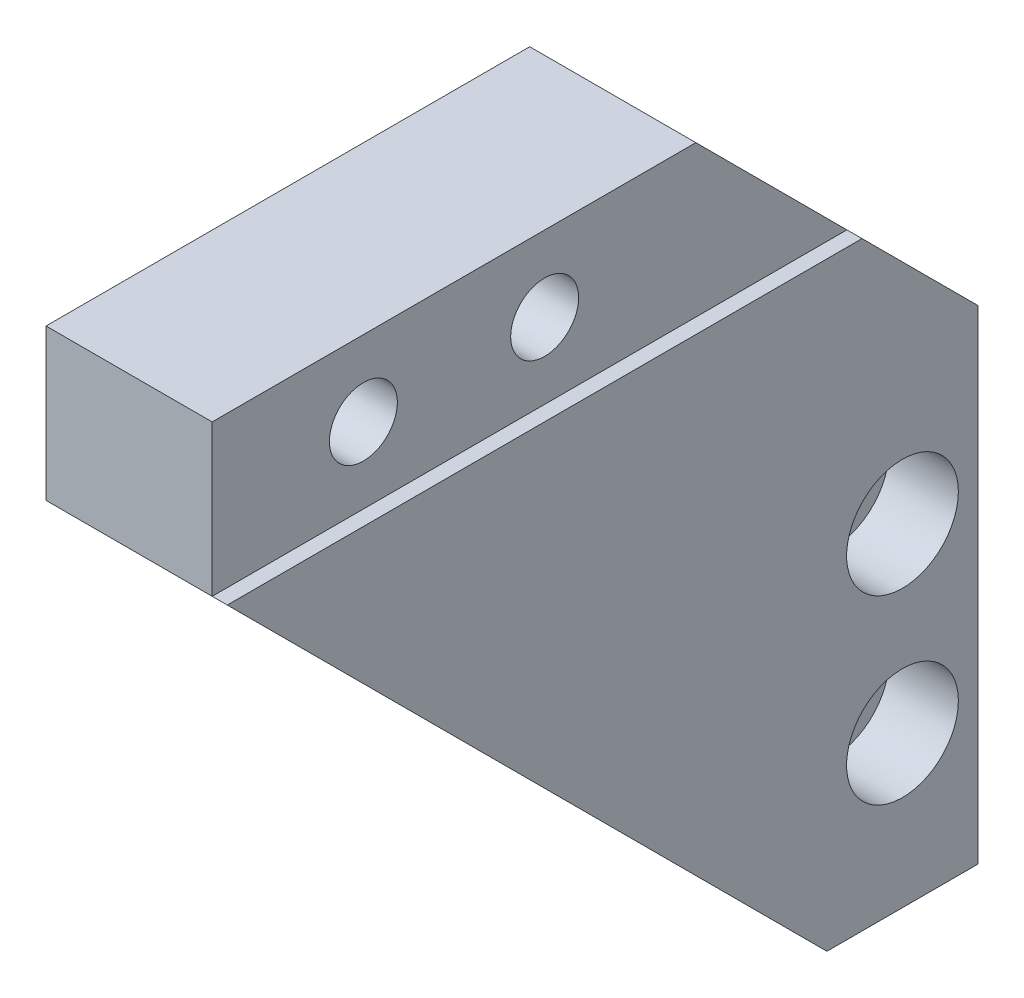
ISO-10303-21;
HEADER;
FILE_DESCRIPTION(('STEP AP214'),'2;1');
FILE_NAME('part.step','',(''),(''),'','','');
FILE_SCHEMA(('AUTOMOTIVE_DESIGN { 1 0 10303 214 1 1 1 1 }'));
ENDSEC;
DATA;
#1=APPLICATION_CONTEXT('core data for automotive mechanical design processes');
#2=APPLICATION_PROTOCOL_DEFINITION('international standard','automotive_design',2000,#1);
#3=PRODUCT_CONTEXT('',#1,'mechanical');
#4=PRODUCT('Part','Part','',(#3));
#5=PRODUCT_RELATED_PRODUCT_CATEGORY('part','',(#4));
#6=PRODUCT_DEFINITION_FORMATION('','',#4);
#7=PRODUCT_DEFINITION_CONTEXT('part definition',#1,'design');
#8=PRODUCT_DEFINITION('design','',#6,#7);
#9=PRODUCT_DEFINITION_SHAPE('','',#8);
#10=(LENGTH_UNIT() NAMED_UNIT(*) SI_UNIT(.MILLI.,.METRE.));
#11=(NAMED_UNIT(*) PLANE_ANGLE_UNIT() SI_UNIT($,.RADIAN.));
#12=(NAMED_UNIT(*) SI_UNIT($,.STERADIAN.) SOLID_ANGLE_UNIT());
#13=UNCERTAINTY_MEASURE_WITH_UNIT(LENGTH_MEASURE(1.E-05),#10,'distance_accuracy_value','');
#14=(GEOMETRIC_REPRESENTATION_CONTEXT(3) GLOBAL_UNCERTAINTY_ASSIGNED_CONTEXT((#13)) GLOBAL_UNIT_ASSIGNED_CONTEXT((#10,
#11,#12)) REPRESENTATION_CONTEXT('',''));
#15=CARTESIAN_POINT('',(0.,0.,0.));
#16=DIRECTION('',(0.,0.,1.));
#17=DIRECTION('',(1.,0.,0.));
#18=AXIS2_PLACEMENT_3D('',#15,#16,#17);
#19=CARTESIAN_POINT('',(6.,-17.6776695296637,-59.7));
#20=DIRECTION('',(0.,0.,1.));
#21=DIRECTION('',(1.,0.,0.));
#22=AXIS2_PLACEMENT_3D('',#19,#20,#21);
#23=PLANE('',#22);
#24=DIRECTION('',(0.,1.,0.));
#25=VECTOR('',#24,1.);
#26=CARTESIAN_POINT('',(6.,-17.6776695296637,-59.7));
#27=LINE('',#26,#25);
#28=CARTESIAN_POINT('',(6.,-49.7,-59.7));
#29=VERTEX_POINT('',#28);
#30=CARTESIAN_POINT('',(6.,-17.6776695296637,-59.7));
#31=VERTEX_POINT('',#30);
#32=EDGE_CURVE('E124',#29,#31,#27,.T.);
#33=ORIENTED_EDGE('',*,*,#32,.F.);
#34=DIRECTION('',(1.,0.,0.));
#35=VECTOR('',#34,1.);
#36=CARTESIAN_POINT('',(-6.,-49.7,-59.7));
#37=LINE('',#36,#35);
#38=CARTESIAN_POINT('',(-5.,-49.7,-59.7));
#39=VERTEX_POINT('',#38);
#40=EDGE_CURVE('E108',#39,#29,#37,.T.);
#41=ORIENTED_EDGE('',*,*,#40,.F.);
#42=DIRECTION('',(0.,-1.,0.));
#43=VECTOR('',#42,1.);
#44=CARTESIAN_POINT('',(-5.,-17.6776695296637,-59.7));
#45=LINE('',#44,#43);
#46=CARTESIAN_POINT('',(-5.,-17.6776695296637,-59.7));
#47=VERTEX_POINT('',#46);
#48=EDGE_CURVE('E254',#47,#39,#45,.T.);
#49=ORIENTED_EDGE('',*,*,#48,.F.);
#50=DIRECTION('',(-1.,0.,0.));
#51=VECTOR('',#50,1.);
#52=CARTESIAN_POINT('',(6.,-17.6776695296637,-59.7));
#53=LINE('',#52,#51);
#54=EDGE_CURVE('E130',#31,#47,#53,.T.);
#55=ORIENTED_EDGE('',*,*,#54,.F.);
#56=EDGE_LOOP('',(#33,#41,#49,#55));
#57=FACE_BOUND('',#56,.T.);
#58=ADVANCED_FACE('F36',(#57),#23,.F.);
#59=CARTESIAN_POINT('',(6.,-59.7,-59.7));
#60=DIRECTION('',(0.,0.707106781186547,-0.707106781186548));
#61=DIRECTION('',(0.,0.707106781186548,0.707106781186547));
#62=AXIS2_PLACEMENT_3D('',#59,#60,#61);
#63=PLANE('',#62);
#64=CARTESIAN_POINT('',(0.,-34.4461940777126,-34.4461940777126));
#65=DIRECTION('',(0.,-0.707106781186548,0.707106781186547));
#66=DIRECTION('',(0.,-0.707106781186547,-0.707106781186548));
#67=AXIS2_PLACEMENT_3D('',#64,#65,#66);
#68=CIRCLE('',#67,4.);
#69=CARTESIAN_POINT('',(0.,-37.2746212024587,-37.2746212024588));
#70=VERTEX_POINT('',#69);
#71=EDGE_CURVE('E155',#70,#70,#68,.T.);
#72=ORIENTED_EDGE('',*,*,#71,.F.);
#73=EDGE_LOOP('',(#72));
#74=FACE_BOUND('',#73,.T.);
#75=CARTESIAN_POINT('',(0.,-25.2538059222874,-25.2538059222875));
#76=DIRECTION('',(0.,-0.707106781186548,0.707106781186547));
#77=DIRECTION('',(0.,-0.707106781186547,-0.707106781186548));
#78=AXIS2_PLACEMENT_3D('',#75,#76,#77);
#79=CIRCLE('',#78,4.);
#80=CARTESIAN_POINT('',(0.,-28.0822330470336,-28.0822330470336));
#81=VERTEX_POINT('',#80);
#82=EDGE_CURVE('E210',#81,#81,#79,.T.);
#83=ORIENTED_EDGE('',*,*,#82,.F.);
#84=EDGE_LOOP('',(#83));
#85=FACE_BOUND('',#84,.T.);
#86=DIRECTION('',(-1.,0.,0.));
#87=VECTOR('',#86,1.);
#88=CARTESIAN_POINT('',(-5.,-49.7,-49.7));
#89=LINE('',#88,#87);
#90=CARTESIAN_POINT('',(-5.,-49.7,-49.7));
#91=VERTEX_POINT('',#90);
#92=CARTESIAN_POINT('',(-6.,-49.7,-49.7));
#93=VERTEX_POINT('',#92);
#94=EDGE_CURVE('E245',#91,#93,#89,.T.);
#95=ORIENTED_EDGE('',*,*,#94,.F.);
#96=DIRECTION('',(1.,0.,0.));
#97=VECTOR('',#96,1.);
#98=CARTESIAN_POINT('',(-6.,-49.7,-49.7));
#99=LINE('',#98,#97);
#100=CARTESIAN_POINT('',(6.,-49.7,-49.7));
#101=VERTEX_POINT('',#100);
#102=EDGE_CURVE('E118',#91,#101,#99,.T.);
#103=ORIENTED_EDGE('',*,*,#102,.T.);
#104=DIRECTION('',(0.,-0.707106781186548,-0.707106781186547));
#105=VECTOR('',#104,1.);
#106=CARTESIAN_POINT('',(6.,-59.7,-59.7));
#107=LINE('',#106,#105);
#108=CARTESIAN_POINT('',(6.,-9.99999999999999,-9.99999999999999));
#109=VERTEX_POINT('',#108);
#110=EDGE_CURVE('E127',#109,#101,#107,.T.);
#111=ORIENTED_EDGE('',*,*,#110,.F.);
#112=DIRECTION('',(1.,0.,0.));
#113=VECTOR('',#112,1.);
#114=CARTESIAN_POINT('',(5.,-10.,-10.));
#115=LINE('',#114,#113);
#116=CARTESIAN_POINT('',(5.,-10.,-10.));
#117=VERTEX_POINT('',#116);
#118=EDGE_CURVE('E59',#117,#109,#115,.T.);
#119=ORIENTED_EDGE('',*,*,#118,.F.);
#120=DIRECTION('',(1.,0.,0.));
#121=VECTOR('',#120,1.);
#122=CARTESIAN_POINT('',(-6.,-9.99999999999998,-9.99999999999998));
#123=LINE('',#122,#121);
#124=CARTESIAN_POINT('',(-6.,-9.99999999999998,-9.99999999999998));
#125=VERTEX_POINT('',#124);
#126=EDGE_CURVE('E182',#125,#117,#123,.T.);
#127=ORIENTED_EDGE('',*,*,#126,.F.);
#128=DIRECTION('',(0.,-0.707106781186548,-0.707106781186547));
#129=VECTOR('',#128,1.);
#130=CARTESIAN_POINT('',(-6.,-59.7,-59.7));
#131=LINE('',#130,#129);
#132=EDGE_CURVE('E51',#125,#93,#131,.T.);
#133=ORIENTED_EDGE('',*,*,#132,.T.);
#134=EDGE_LOOP('',(#95,#103,#111,#119,#127,#133));
#135=FACE_BOUND('',#134,.T.);
#136=ADVANCED_FACE('F38',(#74,#85,#135),#63,.F.);
#137=CARTESIAN_POINT('',(6.,0.,-42.0223304703363));
#138=DIRECTION('',(0.,-0.707106781186547,0.707106781186548));
#139=DIRECTION('',(0.,-0.707106781186548,-0.707106781186547));
#140=AXIS2_PLACEMENT_3D('',#137,#138,#139);
#141=PLANE('',#140);
#142=CARTESIAN_POINT('',(0.,-13.4350288425444,-55.4573593128807));
#143=DIRECTION('',(0.,-0.707106781186547,0.707106781186548));
#144=DIRECTION('',(0.,-0.707106781186548,-0.707106781186547));
#145=AXIS2_PLACEMENT_3D('',#142,#143,#144);
#146=CIRCLE('',#145,2.25);
#147=CARTESIAN_POINT('',(0.,-15.0260191002141,-57.0483495705504));
#148=VERTEX_POINT('',#147);
#149=EDGE_CURVE('E142',#148,#148,#146,.T.);
#150=ORIENTED_EDGE('',*,*,#149,.T.);
#151=EDGE_LOOP('',(#150));
#152=FACE_BOUND('',#151,.T.);
#153=CARTESIAN_POINT('',(0.,-4.24264068711929,-46.2649711574556));
#154=DIRECTION('',(0.,-0.707106781186547,0.707106781186548));
#155=DIRECTION('',(0.,-0.707106781186548,-0.707106781186547));
#156=AXIS2_PLACEMENT_3D('',#153,#154,#155);
#157=CIRCLE('',#156,2.25);
#158=CARTESIAN_POINT('',(0.,-5.83363094478902,-47.8559614151253));
#159=VERTEX_POINT('',#158);
#160=EDGE_CURVE('E152',#159,#159,#157,.T.);
#161=ORIENTED_EDGE('',*,*,#160,.T.);
#162=EDGE_LOOP('',(#161));
#163=FACE_BOUND('',#162,.T.);
#164=DIRECTION('',(0.,-0.707106781186548,-0.707106781186548));
#165=VECTOR('',#164,1.);
#166=CARTESIAN_POINT('',(-5.,-7.67766952966369,-49.7));
#167=LINE('',#166,#165);
#168=CARTESIAN_POINT('',(-5.,-7.67766952966369,-49.7));
#169=VERTEX_POINT('',#168);
#170=EDGE_CURVE('E297',#169,#47,#167,.T.);
#171=ORIENTED_EDGE('',*,*,#170,.F.);
#172=DIRECTION('',(-1.,0.,0.));
#173=VECTOR('',#172,1.);
#174=CARTESIAN_POINT('',(-5.,-7.67766952966369,-49.7));
#175=LINE('',#174,#173);
#176=CARTESIAN_POINT('',(-6.,-7.67766952966369,-49.7));
#177=VERTEX_POINT('',#176);
#178=EDGE_CURVE('E206',#169,#177,#175,.T.);
#179=ORIENTED_EDGE('',*,*,#178,.T.);
#180=DIRECTION('',(0.,0.707106781186548,0.707106781186547));
#181=VECTOR('',#180,1.);
#182=CARTESIAN_POINT('',(-6.,0.,-42.0223304703363));
#183=LINE('',#182,#181);
#184=CARTESIAN_POINT('',(-6.,0.,-42.0223304703363));
#185=VERTEX_POINT('',#184);
#186=EDGE_CURVE('E141',#177,#185,#183,.T.);
#187=ORIENTED_EDGE('',*,*,#186,.T.);
#188=DIRECTION('',(-1.,0.,0.));
#189=VECTOR('',#188,1.);
#190=CARTESIAN_POINT('',(6.,0.,-42.0223304703363));
#191=LINE('',#190,#189);
#192=CARTESIAN_POINT('',(5.,0.,-42.0223304703363));
#193=VERTEX_POINT('',#192);
#194=EDGE_CURVE('E134',#193,#185,#191,.T.);
#195=ORIENTED_EDGE('',*,*,#194,.F.);
#196=DIRECTION('',(0.,-0.707106781186547,-0.707106781186548));
#197=VECTOR('',#196,1.);
#198=CARTESIAN_POINT('',(5.,-10.,-52.0223304703363));
#199=LINE('',#198,#197);
#200=CARTESIAN_POINT('',(5.,-10.,-52.0223304703363));
#201=VERTEX_POINT('',#200);
#202=EDGE_CURVE('E196',#193,#201,#199,.T.);
#203=ORIENTED_EDGE('',*,*,#202,.T.);
#204=DIRECTION('',(1.,0.,0.));
#205=VECTOR('',#204,1.);
#206=CARTESIAN_POINT('',(5.,-10.,-52.0223304703363));
#207=LINE('',#206,#205);
#208=CARTESIAN_POINT('',(6.,-10.,-52.0223304703363));
#209=VERTEX_POINT('',#208);
#210=EDGE_CURVE('E200',#201,#209,#207,.T.);
#211=ORIENTED_EDGE('',*,*,#210,.T.);
#212=DIRECTION('',(0.,0.707106781186548,0.707106781186547));
#213=VECTOR('',#212,1.);
#214=CARTESIAN_POINT('',(6.,0.,-42.0223304703363));
#215=LINE('',#214,#213);
#216=EDGE_CURVE('E132',#31,#209,#215,.T.);
#217=ORIENTED_EDGE('',*,*,#216,.F.);
#218=ORIENTED_EDGE('',*,*,#54,.T.);
#219=EDGE_LOOP('',(#171,#179,#187,#195,#203,#211,#217,#218));
#220=FACE_BOUND('',#219,.T.);
#221=ADVANCED_FACE('F243',(#152,#163,#220),#141,.F.);
#222=CARTESIAN_POINT('',(6.,0.,0.));
#223=DIRECTION('',(0.,-1.,0.));
#224=DIRECTION('',(0.,0.,-1.));
#225=AXIS2_PLACEMENT_3D('',#222,#223,#224);
#226=PLANE('',#225);
#227=DIRECTION('',(0.,0.,1.));
#228=VECTOR('',#227,1.);
#229=CARTESIAN_POINT('',(-6.,0.,0.));
#230=LINE('',#229,#228);
#231=CARTESIAN_POINT('',(-6.,0.,-9.99999999999998));
#232=VERTEX_POINT('',#231);
#233=EDGE_CURVE('E136',#185,#232,#230,.T.);
#234=ORIENTED_EDGE('',*,*,#233,.T.);
#235=DIRECTION('',(1.,0.,0.));
#236=VECTOR('',#235,1.);
#237=CARTESIAN_POINT('',(-6.,0.,-9.99999999999998));
#238=LINE('',#237,#236);
#239=CARTESIAN_POINT('',(5.,0.,-9.99999999999998));
#240=VERTEX_POINT('',#239);
#241=EDGE_CURVE('E180',#232,#240,#238,.T.);
#242=ORIENTED_EDGE('',*,*,#241,.T.);
#243=DIRECTION('',(0.,0.,-1.));
#244=VECTOR('',#243,1.);
#245=CARTESIAN_POINT('',(5.,0.,-42.0223304703363));
#246=LINE('',#245,#244);
#247=EDGE_CURVE('E187',#240,#193,#246,.T.);
#248=ORIENTED_EDGE('',*,*,#247,.T.);
#249=ORIENTED_EDGE('',*,*,#194,.T.);
#250=EDGE_LOOP('',(#234,#242,#248,#249));
#251=FACE_BOUND('',#250,.T.);
#252=ADVANCED_FACE('F186',(#251),#226,.F.);
#253=CARTESIAN_POINT('',(6.,0.,0.));
#254=DIRECTION('',(-1.,0.,0.));
#255=DIRECTION('',(0.,0.,1.));
#256=AXIS2_PLACEMENT_3D('',#253,#254,#255);
#257=PLANE('',#256);
#258=CARTESIAN_POINT('',(6.,-39.6888347648318,-54.7));
#259=DIRECTION('',(1.,0.,0.));
#260=DIRECTION('',(0.,0.,-1.));
#261=AXIS2_PLACEMENT_3D('',#258,#259,#260);
#262=CIRCLE('',#261,3.69999999999999);
#263=CARTESIAN_POINT('',(6.,-39.6888347648318,-58.4));
#264=VERTEX_POINT('',#263);
#265=EDGE_CURVE('E191',#264,#264,#262,.T.);
#266=ORIENTED_EDGE('',*,*,#265,.F.);
#267=EDGE_LOOP('',(#266));
#268=FACE_BOUND('',#267,.T.);
#269=CARTESIAN_POINT('',(6.,-27.6888347648318,-54.7));
#270=DIRECTION('',(1.,0.,0.));
#271=DIRECTION('',(0.,0.,-1.));
#272=AXIS2_PLACEMENT_3D('',#269,#270,#271);
#273=CIRCLE('',#272,3.69999999999999);
#274=CARTESIAN_POINT('',(6.,-27.6888347648318,-58.4));
#275=VERTEX_POINT('',#274);
#276=EDGE_CURVE('E174',#275,#275,#273,.T.);
#277=ORIENTED_EDGE('',*,*,#276,.F.);
#278=EDGE_LOOP('',(#277));
#279=FACE_BOUND('',#278,.T.);
#280=ORIENTED_EDGE('',*,*,#110,.T.);
#281=DIRECTION('',(0.,0.,1.));
#282=VECTOR('',#281,1.);
#283=CARTESIAN_POINT('',(6.,-49.7,-59.7));
#284=LINE('',#283,#282);
#285=EDGE_CURVE('E111',#29,#101,#284,.T.);
#286=ORIENTED_EDGE('',*,*,#285,.F.);
#287=ORIENTED_EDGE('',*,*,#32,.T.);
#288=ORIENTED_EDGE('',*,*,#216,.T.);
#289=DIRECTION('',(0.,0.,1.));
#290=VECTOR('',#289,1.);
#291=CARTESIAN_POINT('',(6.,-10.,-10.));
#292=LINE('',#291,#290);
#293=EDGE_CURVE('E205',#209,#109,#292,.T.);
#294=ORIENTED_EDGE('',*,*,#293,.T.);
#295=EDGE_LOOP('',(#280,#286,#287,#288,#294));
#296=FACE_BOUND('',#295,.T.);
#297=ADVANCED_FACE('F122',(#268,#279,#296),#257,.F.);
#298=CARTESIAN_POINT('',(-6.,0.,0.));
#299=DIRECTION('',(-1.,0.,0.));
#300=DIRECTION('',(0.,0.,1.));
#301=AXIS2_PLACEMENT_3D('',#298,#299,#300);
#302=PLANE('',#301);
#303=DIRECTION('',(0.,1.,0.));
#304=VECTOR('',#303,1.);
#305=CARTESIAN_POINT('',(-6.,-9.99999999999998,-9.99999999999998));
#306=LINE('',#305,#304);
#307=EDGE_CURVE('E264',#125,#232,#306,.T.);
#308=ORIENTED_EDGE('',*,*,#307,.T.);
#309=ORIENTED_EDGE('',*,*,#233,.F.);
#310=ORIENTED_EDGE('',*,*,#186,.F.);
#311=DIRECTION('',(0.,1.,0.));
#312=VECTOR('',#311,1.);
#313=CARTESIAN_POINT('',(-6.,-49.7,-49.7));
#314=LINE('',#313,#312);
#315=EDGE_CURVE('E160',#93,#177,#314,.T.);
#316=ORIENTED_EDGE('',*,*,#315,.F.);
#317=ORIENTED_EDGE('',*,*,#132,.F.);
#318=EDGE_LOOP('',(#308,#309,#310,#316,#317));
#319=FACE_BOUND('',#318,.T.);
#320=CARTESIAN_POINT('',(-6.,-5.,-20.0111652351682));
#321=DIRECTION('',(-1.,0.,0.));
#322=DIRECTION('',(0.,0.,1.));
#323=AXIS2_PLACEMENT_3D('',#320,#321,#322);
#324=CIRCLE('',#323,3.7);
#325=CARTESIAN_POINT('',(-6.,-5.,-16.3111652351682));
#326=VERTEX_POINT('',#325);
#327=EDGE_CURVE('E170',#326,#326,#324,.T.);
#328=ORIENTED_EDGE('',*,*,#327,.F.);
#329=EDGE_LOOP('',(#328));
#330=FACE_BOUND('',#329,.T.);
#331=CARTESIAN_POINT('',(-6.,-5.,-32.0111652351682));
#332=DIRECTION('',(-1.,0.,0.));
#333=DIRECTION('',(0.,0.,1.));
#334=AXIS2_PLACEMENT_3D('',#331,#332,#333);
#335=CIRCLE('',#334,3.7);
#336=CARTESIAN_POINT('',(-6.,-5.,-28.3111652351682));
#337=VERTEX_POINT('',#336);
#338=EDGE_CURVE('E165',#337,#337,#335,.T.);
#339=ORIENTED_EDGE('',*,*,#338,.F.);
#340=EDGE_LOOP('',(#339));
#341=FACE_BOUND('',#340,.T.);
#342=ADVANCED_FACE('F262',(#319,#330,#341),#302,.T.);
#343=CARTESIAN_POINT('',(0.,-34.4461940777126,-34.4461940777126));
#344=DIRECTION('',(0.,-0.707106781186548,0.707106781186547));
#345=DIRECTION('',(0.,-0.707106781186547,-0.707106781186548));
#346=AXIS2_PLACEMENT_3D('',#343,#344,#345);
#347=CYLINDRICAL_SURFACE('',#346,2.25);
#348=CARTESIAN_POINT('',(0.,-31.1935028842544,-37.6988852711707));
#349=DIRECTION('',(0.,-0.707106781186548,0.707106781186547));
#350=DIRECTION('',(0.,-0.707106781186547,-0.707106781186548));
#351=AXIS2_PLACEMENT_3D('',#348,#349,#350);
#352=CIRCLE('',#351,2.25);
#353=CARTESIAN_POINT('',(0.,-32.7844931419242,-39.2898755288404));
#354=VERTEX_POINT('',#353);
#355=EDGE_CURVE('E151',#354,#354,#352,.T.);
#356=ORIENTED_EDGE('',*,*,#355,.T.);
#357=EDGE_LOOP('',(#356));
#358=FACE_BOUND('',#357,.T.);
#359=ORIENTED_EDGE('',*,*,#149,.F.);
#360=EDGE_LOOP('',(#359));
#361=FACE_BOUND('',#360,.T.);
#362=ADVANCED_FACE('F225',(#358,#361),#347,.F.);
#363=CARTESIAN_POINT('',(2.25,-31.1935028842544,-37.6988852711707));
#364=DIRECTION('',(0.,0.707106781186548,-0.707106781186547));
#365=DIRECTION('',(0.,0.707106781186547,0.707106781186548));
#366=AXIS2_PLACEMENT_3D('',#363,#364,#365);
#367=PLANE('',#366);
#368=ORIENTED_EDGE('',*,*,#355,.F.);
#369=EDGE_LOOP('',(#368));
#370=FACE_BOUND('',#369,.T.);
#371=CARTESIAN_POINT('',(0.,-31.1935028842544,-37.6988852711707));
#372=DIRECTION('',(0.,-0.707106781186548,0.707106781186547));
#373=DIRECTION('',(0.,-0.707106781186547,-0.707106781186548));
#374=AXIS2_PLACEMENT_3D('',#371,#372,#373);
#375=CIRCLE('',#374,4.);
#376=CARTESIAN_POINT('',(0.,-34.0219300090006,-40.5273123959169));
#377=VERTEX_POINT('',#376);
#378=EDGE_CURVE('E220',#377,#377,#375,.T.);
#379=ORIENTED_EDGE('',*,*,#378,.T.);
#380=EDGE_LOOP('',(#379));
#381=FACE_BOUND('',#380,.T.);
#382=ADVANCED_FACE('F228',(#370,#381),#367,.F.);
#383=CARTESIAN_POINT('',(0.,-34.4461940777126,-34.4461940777126));
#384=DIRECTION('',(0.,-0.707106781186548,0.707106781186547));
#385=DIRECTION('',(0.,-0.707106781186547,-0.707106781186548));
#386=AXIS2_PLACEMENT_3D('',#383,#384,#385);
#387=CYLINDRICAL_SURFACE('',#386,4.);
#388=ORIENTED_EDGE('',*,*,#378,.F.);
#389=EDGE_LOOP('',(#388));
#390=FACE_BOUND('',#389,.T.);
#391=ORIENTED_EDGE('',*,*,#71,.T.);
#392=EDGE_LOOP('',(#391));
#393=FACE_BOUND('',#392,.T.);
#394=ADVANCED_FACE('F231',(#390,#393),#387,.F.);
#395=CARTESIAN_POINT('',(0.,-25.2538059222874,-25.2538059222875));
#396=DIRECTION('',(0.,-0.707106781186548,0.707106781186547));
#397=DIRECTION('',(0.,-0.707106781186547,-0.707106781186548));
#398=AXIS2_PLACEMENT_3D('',#395,#396,#397);
#399=CYLINDRICAL_SURFACE('',#398,2.25);
#400=CARTESIAN_POINT('',(0.,-22.0011147288293,-28.5064971157456));
#401=DIRECTION('',(0.,-0.707106781186548,0.707106781186547));
#402=DIRECTION('',(0.,-0.707106781186547,-0.707106781186548));
#403=AXIS2_PLACEMENT_3D('',#400,#401,#402);
#404=CIRCLE('',#403,2.25);
#405=CARTESIAN_POINT('',(0.,-23.5921049864991,-30.0974873734153));
#406=VERTEX_POINT('',#405);
#407=EDGE_CURVE('E156',#406,#406,#404,.T.);
#408=ORIENTED_EDGE('',*,*,#407,.T.);
#409=EDGE_LOOP('',(#408));
#410=FACE_BOUND('',#409,.T.);
#411=ORIENTED_EDGE('',*,*,#160,.F.);
#412=EDGE_LOOP('',(#411));
#413=FACE_BOUND('',#412,.T.);
#414=ADVANCED_FACE('F237',(#410,#413),#399,.F.);
#415=CARTESIAN_POINT('',(2.25,-22.0011147288293,-28.5064971157456));
#416=DIRECTION('',(0.,0.707106781186548,-0.707106781186547));
#417=DIRECTION('',(0.,0.707106781186547,0.707106781186548));
#418=AXIS2_PLACEMENT_3D('',#415,#416,#417);
#419=PLANE('',#418);
#420=ORIENTED_EDGE('',*,*,#407,.F.);
#421=EDGE_LOOP('',(#420));
#422=FACE_BOUND('',#421,.T.);
#423=CARTESIAN_POINT('',(0.,-22.0011147288293,-28.5064971157456));
#424=DIRECTION('',(0.,-0.707106781186548,0.707106781186547));
#425=DIRECTION('',(0.,-0.707106781186547,-0.707106781186548));
#426=AXIS2_PLACEMENT_3D('',#423,#424,#425);
#427=CIRCLE('',#426,4.);
#428=CARTESIAN_POINT('',(0.,-24.8295418535755,-31.3349242404918));
#429=VERTEX_POINT('',#428);
#430=EDGE_CURVE('E213',#429,#429,#427,.T.);
#431=ORIENTED_EDGE('',*,*,#430,.T.);
#432=EDGE_LOOP('',(#431));
#433=FACE_BOUND('',#432,.T.);
#434=ADVANCED_FACE('F354',(#422,#433),#419,.F.);
#435=CARTESIAN_POINT('',(0.,-25.2538059222874,-25.2538059222875));
#436=DIRECTION('',(0.,-0.707106781186548,0.707106781186547));
#437=DIRECTION('',(0.,-0.707106781186547,-0.707106781186548));
#438=AXIS2_PLACEMENT_3D('',#435,#436,#437);
#439=CYLINDRICAL_SURFACE('',#438,4.);
#440=ORIENTED_EDGE('',*,*,#430,.F.);
#441=EDGE_LOOP('',(#440));
#442=FACE_BOUND('',#441,.T.);
#443=ORIENTED_EDGE('',*,*,#82,.T.);
#444=EDGE_LOOP('',(#443));
#445=FACE_BOUND('',#444,.T.);
#446=ADVANCED_FACE('F360',(#442,#445),#439,.F.);
#447=CARTESIAN_POINT('',(5.,-10.,-10.));
#448=DIRECTION('',(0.,1.,0.));
#449=DIRECTION('',(0.,0.,1.));
#450=AXIS2_PLACEMENT_3D('',#447,#448,#449);
#451=PLANE('',#450);
#452=ORIENTED_EDGE('',*,*,#293,.F.);
#453=ORIENTED_EDGE('',*,*,#210,.F.);
#454=DIRECTION('',(0.,0.,1.));
#455=VECTOR('',#454,1.);
#456=CARTESIAN_POINT('',(5.,-10.,-10.));
#457=LINE('',#456,#455);
#458=EDGE_CURVE('E198',#201,#117,#457,.T.);
#459=ORIENTED_EDGE('',*,*,#458,.T.);
#460=ORIENTED_EDGE('',*,*,#118,.T.);
#461=EDGE_LOOP('',(#452,#453,#459,#460));
#462=FACE_BOUND('',#461,.T.);
#463=ADVANCED_FACE('F395',(#462),#451,.T.);
#464=CARTESIAN_POINT('',(5.,0.,0.));
#465=DIRECTION('',(1.,0.,0.));
#466=DIRECTION('',(0.,0.,-1.));
#467=AXIS2_PLACEMENT_3D('',#464,#465,#466);
#468=PLANE('',#467);
#469=DIRECTION('',(0.,1.,0.));
#470=VECTOR('',#469,1.);
#471=CARTESIAN_POINT('',(5.,0.,-9.99999999999998));
#472=LINE('',#471,#470);
#473=EDGE_CURVE('E44',#117,#240,#472,.T.);
#474=ORIENTED_EDGE('',*,*,#473,.F.);
#475=ORIENTED_EDGE('',*,*,#458,.F.);
#476=ORIENTED_EDGE('',*,*,#202,.F.);
#477=ORIENTED_EDGE('',*,*,#247,.F.);
#478=EDGE_LOOP('',(#474,#475,#476,#477));
#479=FACE_BOUND('',#478,.T.);
#480=CARTESIAN_POINT('',(5.,-5.,-20.0111652351682));
#481=DIRECTION('',(1.,0.,0.));
#482=DIRECTION('',(0.,0.,-1.));
#483=AXIS2_PLACEMENT_3D('',#480,#481,#482);
#484=CIRCLE('',#483,2.25000000000001);
#485=CARTESIAN_POINT('',(5.,-5.,-22.2611652351682));
#486=VERTEX_POINT('',#485);
#487=EDGE_CURVE('E162',#486,#486,#484,.T.);
#488=ORIENTED_EDGE('',*,*,#487,.F.);
#489=EDGE_LOOP('',(#488));
#490=FACE_BOUND('',#489,.T.);
#491=CARTESIAN_POINT('',(5.,-5.,-32.0111652351682));
#492=DIRECTION('',(1.,0.,0.));
#493=DIRECTION('',(0.,0.,-1.));
#494=AXIS2_PLACEMENT_3D('',#491,#492,#493);
#495=CIRCLE('',#494,2.25000000000001);
#496=CARTESIAN_POINT('',(5.,-5.,-34.2611652351682));
#497=VERTEX_POINT('',#496);
#498=EDGE_CURVE('E157',#497,#497,#495,.T.);
#499=ORIENTED_EDGE('',*,*,#498,.F.);
#500=EDGE_LOOP('',(#499));
#501=FACE_BOUND('',#500,.T.);
#502=ADVANCED_FACE('F193',(#479,#490,#501),#468,.T.);
#503=CARTESIAN_POINT('',(-5.,-49.7,-49.7));
#504=DIRECTION('',(0.,0.,1.));
#505=DIRECTION('',(0.,-1.,0.));
#506=AXIS2_PLACEMENT_3D('',#503,#504,#505);
#507=PLANE('',#506);
#508=ORIENTED_EDGE('',*,*,#315,.T.);
#509=ORIENTED_EDGE('',*,*,#178,.F.);
#510=DIRECTION('',(0.,1.,0.));
#511=VECTOR('',#510,1.);
#512=CARTESIAN_POINT('',(-5.,-49.7,-49.7));
#513=LINE('',#512,#511);
#514=EDGE_CURVE('E249',#91,#169,#513,.T.);
#515=ORIENTED_EDGE('',*,*,#514,.F.);
#516=ORIENTED_EDGE('',*,*,#94,.T.);
#517=EDGE_LOOP('',(#508,#509,#515,#516));
#518=FACE_BOUND('',#517,.T.);
#519=ADVANCED_FACE('F299',(#518),#507,.F.);
#520=CARTESIAN_POINT('',(-5.,0.,0.));
#521=DIRECTION('',(-1.,0.,0.));
#522=DIRECTION('',(0.,0.,1.));
#523=AXIS2_PLACEMENT_3D('',#520,#521,#522);
#524=PLANE('',#523);
#525=DIRECTION('',(0.,0.,-1.));
#526=VECTOR('',#525,1.);
#527=CARTESIAN_POINT('',(-5.,-49.7,0.));
#528=LINE('',#527,#526);
#529=EDGE_CURVE('E11',#91,#39,#528,.T.);
#530=ORIENTED_EDGE('',*,*,#529,.F.);
#531=ORIENTED_EDGE('',*,*,#514,.T.);
#532=ORIENTED_EDGE('',*,*,#170,.T.);
#533=ORIENTED_EDGE('',*,*,#48,.T.);
#534=EDGE_LOOP('',(#530,#531,#532,#533));
#535=FACE_BOUND('',#534,.T.);
#536=CARTESIAN_POINT('',(-5.,-39.6888347648318,-54.7));
#537=DIRECTION('',(-1.,0.,0.));
#538=DIRECTION('',(0.,0.,1.));
#539=AXIS2_PLACEMENT_3D('',#536,#537,#538);
#540=CIRCLE('',#539,2.25000000000001);
#541=CARTESIAN_POINT('',(-5.,-39.6888347648318,-52.45));
#542=VERTEX_POINT('',#541);
#543=EDGE_CURVE('E172',#542,#542,#540,.T.);
#544=ORIENTED_EDGE('',*,*,#543,.F.);
#545=EDGE_LOOP('',(#544));
#546=FACE_BOUND('',#545,.T.);
#547=CARTESIAN_POINT('',(-5.,-27.6888347648318,-54.7));
#548=DIRECTION('',(-1.,0.,0.));
#549=DIRECTION('',(0.,0.,1.));
#550=AXIS2_PLACEMENT_3D('',#547,#548,#549);
#551=CIRCLE('',#550,2.25000000000001);
#552=CARTESIAN_POINT('',(-5.,-27.6888347648318,-52.45));
#553=VERTEX_POINT('',#552);
#554=EDGE_CURVE('E167',#553,#553,#551,.T.);
#555=ORIENTED_EDGE('',*,*,#554,.F.);
#556=EDGE_LOOP('',(#555));
#557=FACE_BOUND('',#556,.T.);
#558=ADVANCED_FACE('F301',(#535,#546,#557),#524,.T.);
#559=CARTESIAN_POINT('',(-6.,-5.,-32.0111652351682));
#560=DIRECTION('',(-1.,0.,0.));
#561=DIRECTION('',(0.,0.,1.));
#562=AXIS2_PLACEMENT_3D('',#559,#560,#561);
#563=CYLINDRICAL_SURFACE('',#562,2.25000000000001);
#564=ORIENTED_EDGE('',*,*,#498,.T.);
#565=EDGE_LOOP('',(#564));
#566=FACE_BOUND('',#565,.T.);
#567=CARTESIAN_POINT('',(-1.4,-5.,-32.0111652351682));
#568=DIRECTION('',(-1.,0.,0.));
#569=DIRECTION('',(0.,0.,1.));
#570=AXIS2_PLACEMENT_3D('',#567,#568,#569);
#571=CIRCLE('',#570,2.25000000000001);
#572=CARTESIAN_POINT('',(-1.4,-5.,-29.7611652351681));
#573=VERTEX_POINT('',#572);
#574=EDGE_CURVE('E161',#573,#573,#571,.T.);
#575=ORIENTED_EDGE('',*,*,#574,.T.);
#576=EDGE_LOOP('',(#575));
#577=FACE_BOUND('',#576,.T.);
#578=ADVANCED_FACE('F304',(#566,#577),#563,.F.);
#579=CARTESIAN_POINT('',(-1.4,-2.74999999999999,-32.0111652351682));
#580=DIRECTION('',(1.,0.,0.));
#581=DIRECTION('',(0.,0.,-1.));
#582=AXIS2_PLACEMENT_3D('',#579,#580,#581);
#583=PLANE('',#582);
#584=ORIENTED_EDGE('',*,*,#574,.F.);
#585=EDGE_LOOP('',(#584));
#586=FACE_BOUND('',#585,.T.);
#587=CARTESIAN_POINT('',(-1.4,-5.,-32.0111652351682));
#588=DIRECTION('',(-1.,0.,0.));
#589=DIRECTION('',(0.,0.,1.));
#590=AXIS2_PLACEMENT_3D('',#587,#588,#589);
#591=CIRCLE('',#590,3.7);
#592=CARTESIAN_POINT('',(-1.4,-5.,-28.3111652351682));
#593=VERTEX_POINT('',#592);
#594=EDGE_CURVE('E292',#593,#593,#591,.T.);
#595=ORIENTED_EDGE('',*,*,#594,.T.);
#596=EDGE_LOOP('',(#595));
#597=FACE_BOUND('',#596,.T.);
#598=ADVANCED_FACE('F413',(#586,#597),#583,.F.);
#599=CARTESIAN_POINT('',(-6.,-5.,-32.0111652351682));
#600=DIRECTION('',(-1.,0.,0.));
#601=DIRECTION('',(0.,0.,1.));
#602=AXIS2_PLACEMENT_3D('',#599,#600,#601);
#603=CYLINDRICAL_SURFACE('',#602,3.7);
#604=ORIENTED_EDGE('',*,*,#594,.F.);
#605=EDGE_LOOP('',(#604));
#606=FACE_BOUND('',#605,.T.);
#607=ORIENTED_EDGE('',*,*,#338,.T.);
#608=EDGE_LOOP('',(#607));
#609=FACE_BOUND('',#608,.T.);
#610=ADVANCED_FACE('F424',(#606,#609),#603,.F.);
#611=CARTESIAN_POINT('',(-6.,-5.,-20.0111652351682));
#612=DIRECTION('',(-1.,0.,0.));
#613=DIRECTION('',(0.,0.,1.));
#614=AXIS2_PLACEMENT_3D('',#611,#612,#613);
#615=CYLINDRICAL_SURFACE('',#614,2.25000000000001);
#616=ORIENTED_EDGE('',*,*,#487,.T.);
#617=EDGE_LOOP('',(#616));
#618=FACE_BOUND('',#617,.T.);
#619=CARTESIAN_POINT('',(-1.4,-5.,-20.0111652351682));
#620=DIRECTION('',(-1.,0.,0.));
#621=DIRECTION('',(0.,0.,1.));
#622=AXIS2_PLACEMENT_3D('',#619,#620,#621);
#623=CIRCLE('',#622,2.25000000000001);
#624=CARTESIAN_POINT('',(-1.4,-5.,-17.7611652351681));
#625=VERTEX_POINT('',#624);
#626=EDGE_CURVE('E166',#625,#625,#623,.T.);
#627=ORIENTED_EDGE('',*,*,#626,.T.);
#628=EDGE_LOOP('',(#627));
#629=FACE_BOUND('',#628,.T.);
#630=ADVANCED_FACE('F434',(#618,#629),#615,.F.);
#631=CARTESIAN_POINT('',(-1.4,-2.74999999999999,-20.0111652351682));
#632=DIRECTION('',(1.,0.,0.));
#633=DIRECTION('',(0.,0.,-1.));
#634=AXIS2_PLACEMENT_3D('',#631,#632,#633);
#635=PLANE('',#634);
#636=ORIENTED_EDGE('',*,*,#626,.F.);
#637=EDGE_LOOP('',(#636));
#638=FACE_BOUND('',#637,.T.);
#639=CARTESIAN_POINT('',(-1.4,-5.,-20.0111652351682));
#640=DIRECTION('',(-1.,0.,0.));
#641=DIRECTION('',(0.,0.,1.));
#642=AXIS2_PLACEMENT_3D('',#639,#640,#641);
#643=CIRCLE('',#642,3.7);
#644=CARTESIAN_POINT('',(-1.4,-5.,-16.3111652351682));
#645=VERTEX_POINT('',#644);
#646=EDGE_CURVE('E285',#645,#645,#643,.T.);
#647=ORIENTED_EDGE('',*,*,#646,.T.);
#648=EDGE_LOOP('',(#647));
#649=FACE_BOUND('',#648,.T.);
#650=ADVANCED_FACE('F444',(#638,#649),#635,.F.);
#651=CARTESIAN_POINT('',(-6.,-5.,-20.0111652351682));
#652=DIRECTION('',(-1.,0.,0.));
#653=DIRECTION('',(0.,0.,1.));
#654=AXIS2_PLACEMENT_3D('',#651,#652,#653);
#655=CYLINDRICAL_SURFACE('',#654,3.7);
#656=ORIENTED_EDGE('',*,*,#646,.F.);
#657=EDGE_LOOP('',(#656));
#658=FACE_BOUND('',#657,.T.);
#659=ORIENTED_EDGE('',*,*,#327,.T.);
#660=EDGE_LOOP('',(#659));
#661=FACE_BOUND('',#660,.T.);
#662=ADVANCED_FACE('F314',(#658,#661),#655,.F.);
#663=CARTESIAN_POINT('',(6.,-27.6888347648318,-54.7));
#664=DIRECTION('',(1.,0.,0.));
#665=DIRECTION('',(0.,0.,-1.));
#666=AXIS2_PLACEMENT_3D('',#663,#664,#665);
#667=CYLINDRICAL_SURFACE('',#666,2.25000000000001);
#668=ORIENTED_EDGE('',*,*,#554,.T.);
#669=EDGE_LOOP('',(#668));
#670=FACE_BOUND('',#669,.T.);
#671=CARTESIAN_POINT('',(1.4,-27.6888347648318,-54.7));
#672=DIRECTION('',(1.,0.,0.));
#673=DIRECTION('',(0.,0.,-1.));
#674=AXIS2_PLACEMENT_3D('',#671,#672,#673);
#675=CIRCLE('',#674,2.25000000000001);
#676=CARTESIAN_POINT('',(1.4,-27.6888347648318,-56.95));
#677=VERTEX_POINT('',#676);
#678=EDGE_CURVE('E171',#677,#677,#675,.T.);
#679=ORIENTED_EDGE('',*,*,#678,.T.);
#680=EDGE_LOOP('',(#679));
#681=FACE_BOUND('',#680,.T.);
#682=ADVANCED_FACE('F310',(#670,#681),#667,.F.);
#683=CARTESIAN_POINT('',(1.4,-25.4388347648318,-54.7));
#684=DIRECTION('',(-1.,0.,0.));
#685=DIRECTION('',(0.,0.,1.));
#686=AXIS2_PLACEMENT_3D('',#683,#684,#685);
#687=PLANE('',#686);
#688=ORIENTED_EDGE('',*,*,#678,.F.);
#689=EDGE_LOOP('',(#688));
#690=FACE_BOUND('',#689,.T.);
#691=CARTESIAN_POINT('',(1.4,-27.6888347648318,-54.7));
#692=DIRECTION('',(1.,0.,0.));
#693=DIRECTION('',(0.,0.,-1.));
#694=AXIS2_PLACEMENT_3D('',#691,#692,#693);
#695=CIRCLE('',#694,3.69999999999999);
#696=CARTESIAN_POINT('',(1.4,-27.6888347648318,-58.4));
#697=VERTEX_POINT('',#696);
#698=EDGE_CURVE('E278',#697,#697,#695,.T.);
#699=ORIENTED_EDGE('',*,*,#698,.T.);
#700=EDGE_LOOP('',(#699));
#701=FACE_BOUND('',#700,.T.);
#702=ADVANCED_FACE('F313',(#690,#701),#687,.F.);
#703=CARTESIAN_POINT('',(6.,-27.6888347648318,-54.7));
#704=DIRECTION('',(1.,0.,0.));
#705=DIRECTION('',(0.,0.,-1.));
#706=AXIS2_PLACEMENT_3D('',#703,#704,#705);
#707=CYLINDRICAL_SURFACE('',#706,3.69999999999999);
#708=ORIENTED_EDGE('',*,*,#698,.F.);
#709=EDGE_LOOP('',(#708));
#710=FACE_BOUND('',#709,.T.);
#711=ORIENTED_EDGE('',*,*,#276,.T.);
#712=EDGE_LOOP('',(#711));
#713=FACE_BOUND('',#712,.T.);
#714=ADVANCED_FACE('F320',(#710,#713),#707,.F.);
#715=CARTESIAN_POINT('',(6.,-39.6888347648318,-54.7));
#716=DIRECTION('',(1.,0.,0.));
#717=DIRECTION('',(0.,0.,-1.));
#718=AXIS2_PLACEMENT_3D('',#715,#716,#717);
#719=CYLINDRICAL_SURFACE('',#718,2.25000000000001);
#720=ORIENTED_EDGE('',*,*,#543,.T.);
#721=EDGE_LOOP('',(#720));
#722=FACE_BOUND('',#721,.T.);
#723=CARTESIAN_POINT('',(1.4,-39.6888347648318,-54.7));
#724=DIRECTION('',(1.,0.,0.));
#725=DIRECTION('',(0.,0.,-1.));
#726=AXIS2_PLACEMENT_3D('',#723,#724,#725);
#727=CIRCLE('',#726,2.25000000000001);
#728=CARTESIAN_POINT('',(1.4,-39.6888347648318,-56.95));
#729=VERTEX_POINT('',#728);
#730=EDGE_CURVE('E175',#729,#729,#727,.T.);
#731=ORIENTED_EDGE('',*,*,#730,.T.);
#732=EDGE_LOOP('',(#731));
#733=FACE_BOUND('',#732,.T.);
#734=ADVANCED_FACE('F326',(#722,#733),#719,.F.);
#735=CARTESIAN_POINT('',(1.4,-37.4388347648318,-54.7));
#736=DIRECTION('',(-1.,0.,0.));
#737=DIRECTION('',(0.,0.,1.));
#738=AXIS2_PLACEMENT_3D('',#735,#736,#737);
#739=PLANE('',#738);
#740=ORIENTED_EDGE('',*,*,#730,.F.);
#741=EDGE_LOOP('',(#740));
#742=FACE_BOUND('',#741,.T.);
#743=CARTESIAN_POINT('',(1.4,-39.6888347648318,-54.7));
#744=DIRECTION('',(1.,0.,0.));
#745=DIRECTION('',(0.,0.,-1.));
#746=AXIS2_PLACEMENT_3D('',#743,#744,#745);
#747=CIRCLE('',#746,3.69999999999999);
#748=CARTESIAN_POINT('',(1.4,-39.6888347648318,-58.4));
#749=VERTEX_POINT('',#748);
#750=EDGE_CURVE('E271',#749,#749,#747,.T.);
#751=ORIENTED_EDGE('',*,*,#750,.T.);
#752=EDGE_LOOP('',(#751));
#753=FACE_BOUND('',#752,.T.);
#754=ADVANCED_FACE('F490',(#742,#753),#739,.F.);
#755=CARTESIAN_POINT('',(6.,-39.6888347648318,-54.7));
#756=DIRECTION('',(1.,0.,0.));
#757=DIRECTION('',(0.,0.,-1.));
#758=AXIS2_PLACEMENT_3D('',#755,#756,#757);
#759=CYLINDRICAL_SURFACE('',#758,3.69999999999999);
#760=ORIENTED_EDGE('',*,*,#750,.F.);
#761=EDGE_LOOP('',(#760));
#762=FACE_BOUND('',#761,.T.);
#763=ORIENTED_EDGE('',*,*,#265,.T.);
#764=EDGE_LOOP('',(#763));
#765=FACE_BOUND('',#764,.T.);
#766=ADVANCED_FACE('F500',(#762,#765),#759,.F.);
#767=CARTESIAN_POINT('',(-6.,-9.99999999999998,-9.99999999999998));
#768=DIRECTION('',(0.,0.,-1.));
#769=DIRECTION('',(-1.,0.,0.));
#770=AXIS2_PLACEMENT_3D('',#767,#768,#769);
#771=PLANE('',#770);
#772=ORIENTED_EDGE('',*,*,#473,.T.);
#773=ORIENTED_EDGE('',*,*,#241,.F.);
#774=ORIENTED_EDGE('',*,*,#307,.F.);
#775=ORIENTED_EDGE('',*,*,#126,.T.);
#776=EDGE_LOOP('',(#772,#773,#774,#775));
#777=FACE_BOUND('',#776,.T.);
#778=ADVANCED_FACE('F179',(#777),#771,.F.);
#779=CARTESIAN_POINT('',(-6.,-49.7,-59.7));
#780=DIRECTION('',(0.,1.,0.));
#781=DIRECTION('',(0.,0.,1.));
#782=AXIS2_PLACEMENT_3D('',#779,#780,#781);
#783=PLANE('',#782);
#784=ORIENTED_EDGE('',*,*,#529,.T.);
#785=ORIENTED_EDGE('',*,*,#40,.T.);
#786=ORIENTED_EDGE('',*,*,#285,.T.);
#787=ORIENTED_EDGE('',*,*,#102,.F.);
#788=EDGE_LOOP('',(#784,#785,#786,#787));
#789=FACE_BOUND('',#788,.T.);
#790=ADVANCED_FACE('F110',(#789),#783,.F.);
#791=CLOSED_SHELL('',(#58,#136,#221,#252,#297,#342,#362,#382,#394,#414,#434,#446,#463,#502,#519,
#558,#578,#598,#610,#630,#650,#662,#682,#702,#714,#734,#754,#766,#778,#790));
#792=MANIFOLD_SOLID_BREP('B2',#791);
#793=ADVANCED_BREP_SHAPE_REPRESENTATION('',(#18,#792),#14);
#794=SHAPE_DEFINITION_REPRESENTATION(#9,#793);
ENDSEC;
END-ISO-10303-21;
